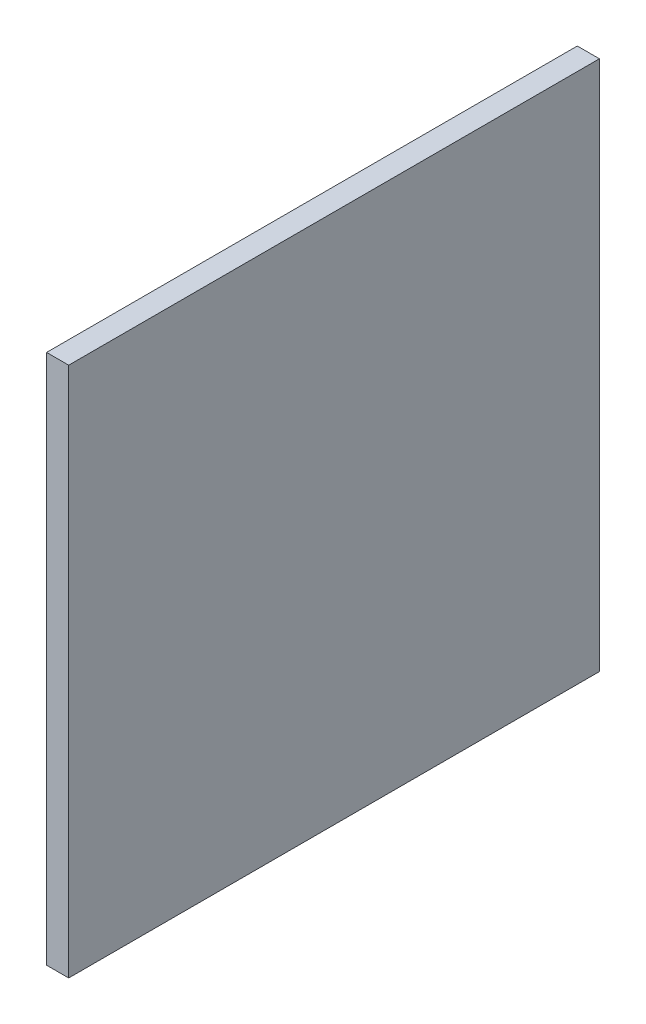
ISO-10303-21;
HEADER;
FILE_DESCRIPTION(('STEP AP214'),'2;1');
FILE_NAME('part.step','',(''),(''),'','','');
FILE_SCHEMA(('AUTOMOTIVE_DESIGN { 1 0 10303 214 1 1 1 1 }'));
ENDSEC;
DATA;
#1=APPLICATION_CONTEXT('core data for automotive mechanical design processes');
#2=APPLICATION_PROTOCOL_DEFINITION('international standard','automotive_design',2000,#1);
#3=PRODUCT_CONTEXT('',#1,'mechanical');
#4=PRODUCT('Part','Part','',(#3));
#5=PRODUCT_RELATED_PRODUCT_CATEGORY('part','',(#4));
#6=PRODUCT_DEFINITION_FORMATION('','',#4);
#7=PRODUCT_DEFINITION_CONTEXT('part definition',#1,'design');
#8=PRODUCT_DEFINITION('design','',#6,#7);
#9=PRODUCT_DEFINITION_SHAPE('','',#8);
#10=(LENGTH_UNIT() NAMED_UNIT(*) SI_UNIT(.MILLI.,.METRE.));
#11=(NAMED_UNIT(*) PLANE_ANGLE_UNIT() SI_UNIT($,.RADIAN.));
#12=(NAMED_UNIT(*) SI_UNIT($,.STERADIAN.) SOLID_ANGLE_UNIT());
#13=UNCERTAINTY_MEASURE_WITH_UNIT(LENGTH_MEASURE(1.E-05),#10,'distance_accuracy_value','');
#14=(GEOMETRIC_REPRESENTATION_CONTEXT(3) GLOBAL_UNCERTAINTY_ASSIGNED_CONTEXT((#13)) GLOBAL_UNIT_ASSIGNED_CONTEXT((#10,
#11,#12)) REPRESENTATION_CONTEXT('',''));
#15=CARTESIAN_POINT('',(0.,0.,0.));
#16=DIRECTION('',(0.,0.,1.));
#17=DIRECTION('',(1.,0.,0.));
#18=AXIS2_PLACEMENT_3D('',#15,#16,#17);
#19=CARTESIAN_POINT('',(1.25,-30.,30.));
#20=DIRECTION('',(-1.,0.,0.));
#21=DIRECTION('',(0.,0.,1.));
#22=AXIS2_PLACEMENT_3D('',#19,#20,#21);
#23=PLANE('',#22);
#24=DIRECTION('',(0.,1.,0.));
#25=VECTOR('',#24,1.);
#26=CARTESIAN_POINT('',(1.25,-30.,-30.));
#27=LINE('',#26,#25);
#28=CARTESIAN_POINT('',(1.25,-30.,-30.));
#29=VERTEX_POINT('',#28);
#30=CARTESIAN_POINT('',(1.25,30.,-30.));
#31=VERTEX_POINT('',#30);
#32=EDGE_CURVE('E105',#29,#31,#27,.T.);
#33=ORIENTED_EDGE('',*,*,#32,.T.);
#34=DIRECTION('',(0.,0.,-1.));
#35=VECTOR('',#34,1.);
#36=CARTESIAN_POINT('',(1.25,30.,30.));
#37=LINE('',#36,#35);
#38=CARTESIAN_POINT('',(1.25,30.,30.));
#39=VERTEX_POINT('',#38);
#40=EDGE_CURVE('E11',#39,#31,#37,.T.);
#41=ORIENTED_EDGE('',*,*,#40,.F.);
#42=DIRECTION('',(0.,1.,0.));
#43=VECTOR('',#42,1.);
#44=CARTESIAN_POINT('',(1.25,-30.,30.));
#45=LINE('',#44,#43);
#46=CARTESIAN_POINT('',(1.25,-30.,30.));
#47=VERTEX_POINT('',#46);
#48=EDGE_CURVE('E93',#47,#39,#45,.T.);
#49=ORIENTED_EDGE('',*,*,#48,.F.);
#50=DIRECTION('',(0.,0.,-1.));
#51=VECTOR('',#50,1.);
#52=CARTESIAN_POINT('',(1.25,-30.,30.));
#53=LINE('',#52,#51);
#54=EDGE_CURVE('E101',#47,#29,#53,.T.);
#55=ORIENTED_EDGE('',*,*,#54,.T.);
#56=EDGE_LOOP('',(#33,#41,#49,#55));
#57=FACE_BOUND('',#56,.T.);
#58=ADVANCED_FACE('F42',(#57),#23,.F.);
#59=CARTESIAN_POINT('',(-1.25,30.,30.));
#60=DIRECTION('',(0.,-1.,0.));
#61=DIRECTION('',(0.,0.,-1.));
#62=AXIS2_PLACEMENT_3D('',#59,#60,#61);
#63=PLANE('',#62);
#64=DIRECTION('',(-1.,0.,0.));
#65=VECTOR('',#64,1.);
#66=CARTESIAN_POINT('',(-1.25,30.,-30.));
#67=LINE('',#66,#65);
#68=CARTESIAN_POINT('',(-1.25,30.,-30.));
#69=VERTEX_POINT('',#68);
#70=EDGE_CURVE('E97',#31,#69,#67,.T.);
#71=ORIENTED_EDGE('',*,*,#70,.T.);
#72=DIRECTION('',(0.,0.,-1.));
#73=VECTOR('',#72,1.);
#74=CARTESIAN_POINT('',(-1.25,30.,30.));
#75=LINE('',#74,#73);
#76=CARTESIAN_POINT('',(-1.25,30.,30.));
#77=VERTEX_POINT('',#76);
#78=EDGE_CURVE('E50',#77,#69,#75,.T.);
#79=ORIENTED_EDGE('',*,*,#78,.F.);
#80=DIRECTION('',(-1.,0.,0.));
#81=VECTOR('',#80,1.);
#82=CARTESIAN_POINT('',(-1.25,30.,30.));
#83=LINE('',#82,#81);
#84=EDGE_CURVE('E88',#39,#77,#83,.T.);
#85=ORIENTED_EDGE('',*,*,#84,.F.);
#86=ORIENTED_EDGE('',*,*,#40,.T.);
#87=EDGE_LOOP('',(#71,#79,#85,#86));
#88=FACE_BOUND('',#87,.T.);
#89=ADVANCED_FACE('F96',(#88),#63,.F.);
#90=CARTESIAN_POINT('',(-1.25,-30.,30.));
#91=DIRECTION('',(1.,0.,0.));
#92=DIRECTION('',(0.,0.,-1.));
#93=AXIS2_PLACEMENT_3D('',#90,#91,#92);
#94=PLANE('',#93);
#95=DIRECTION('',(0.,-1.,0.));
#96=VECTOR('',#95,1.);
#97=CARTESIAN_POINT('',(-1.25,-30.,-30.));
#98=LINE('',#97,#96);
#99=CARTESIAN_POINT('',(-1.25,-30.,-30.));
#100=VERTEX_POINT('',#99);
#101=EDGE_CURVE('E75',#69,#100,#98,.T.);
#102=ORIENTED_EDGE('',*,*,#101,.T.);
#103=DIRECTION('',(0.,0.,-1.));
#104=VECTOR('',#103,1.);
#105=CARTESIAN_POINT('',(-1.25,-30.,30.));
#106=LINE('',#105,#104);
#107=CARTESIAN_POINT('',(-1.25,-30.,30.));
#108=VERTEX_POINT('',#107);
#109=EDGE_CURVE('E98',#108,#100,#106,.T.);
#110=ORIENTED_EDGE('',*,*,#109,.F.);
#111=DIRECTION('',(0.,-1.,0.));
#112=VECTOR('',#111,1.);
#113=CARTESIAN_POINT('',(-1.25,-30.,30.));
#114=LINE('',#113,#112);
#115=EDGE_CURVE('E91',#77,#108,#114,.T.);
#116=ORIENTED_EDGE('',*,*,#115,.F.);
#117=ORIENTED_EDGE('',*,*,#78,.T.);
#118=EDGE_LOOP('',(#102,#110,#116,#117));
#119=FACE_BOUND('',#118,.T.);
#120=ADVANCED_FACE('F99',(#119),#94,.F.);
#121=CARTESIAN_POINT('',(-1.25,-30.,30.));
#122=DIRECTION('',(0.,1.,0.));
#123=DIRECTION('',(0.,0.,1.));
#124=AXIS2_PLACEMENT_3D('',#121,#122,#123);
#125=PLANE('',#124);
#126=DIRECTION('',(1.,0.,0.));
#127=VECTOR('',#126,1.);
#128=CARTESIAN_POINT('',(-1.25,-30.,-30.));
#129=LINE('',#128,#127);
#130=EDGE_CURVE('E81',#100,#29,#129,.T.);
#131=ORIENTED_EDGE('',*,*,#130,.T.);
#132=ORIENTED_EDGE('',*,*,#54,.F.);
#133=DIRECTION('',(1.,0.,0.));
#134=VECTOR('',#133,1.);
#135=CARTESIAN_POINT('',(-1.25,-30.,30.));
#136=LINE('',#135,#134);
#137=EDGE_CURVE('E58',#108,#47,#136,.T.);
#138=ORIENTED_EDGE('',*,*,#137,.F.);
#139=ORIENTED_EDGE('',*,*,#109,.T.);
#140=EDGE_LOOP('',(#131,#132,#138,#139));
#141=FACE_BOUND('',#140,.T.);
#142=ADVANCED_FACE('F112',(#141),#125,.F.);
#143=CARTESIAN_POINT('',(0.,0.,30.));
#144=DIRECTION('',(0.,0.,-1.));
#145=DIRECTION('',(-1.,0.,0.));
#146=AXIS2_PLACEMENT_3D('',#143,#144,#145);
#147=PLANE('',#146);
#148=ORIENTED_EDGE('',*,*,#48,.T.);
#149=ORIENTED_EDGE('',*,*,#84,.T.);
#150=ORIENTED_EDGE('',*,*,#115,.T.);
#151=ORIENTED_EDGE('',*,*,#137,.T.);
#152=EDGE_LOOP('',(#148,#149,#150,#151));
#153=FACE_BOUND('',#152,.T.);
#154=ADVANCED_FACE('F89',(#153),#147,.F.);
#155=CARTESIAN_POINT('',(0.,0.,-30.));
#156=DIRECTION('',(0.,0.,-1.));
#157=DIRECTION('',(-1.,0.,0.));
#158=AXIS2_PLACEMENT_3D('',#155,#156,#157);
#159=PLANE('',#158);
#160=ORIENTED_EDGE('',*,*,#32,.F.);
#161=ORIENTED_EDGE('',*,*,#130,.F.);
#162=ORIENTED_EDGE('',*,*,#101,.F.);
#163=ORIENTED_EDGE('',*,*,#70,.F.);
#164=EDGE_LOOP('',(#160,#161,#162,#163));
#165=FACE_BOUND('',#164,.T.);
#166=ADVANCED_FACE('F115',(#165),#159,.T.);
#167=CLOSED_SHELL('',(#58,#89,#120,#142,#154,#166));
#168=MANIFOLD_SOLID_BREP('B2',#167);
#169=ADVANCED_BREP_SHAPE_REPRESENTATION('',(#18,#168),#14);
#170=SHAPE_DEFINITION_REPRESENTATION(#9,#169);
ENDSEC;
END-ISO-10303-21;
